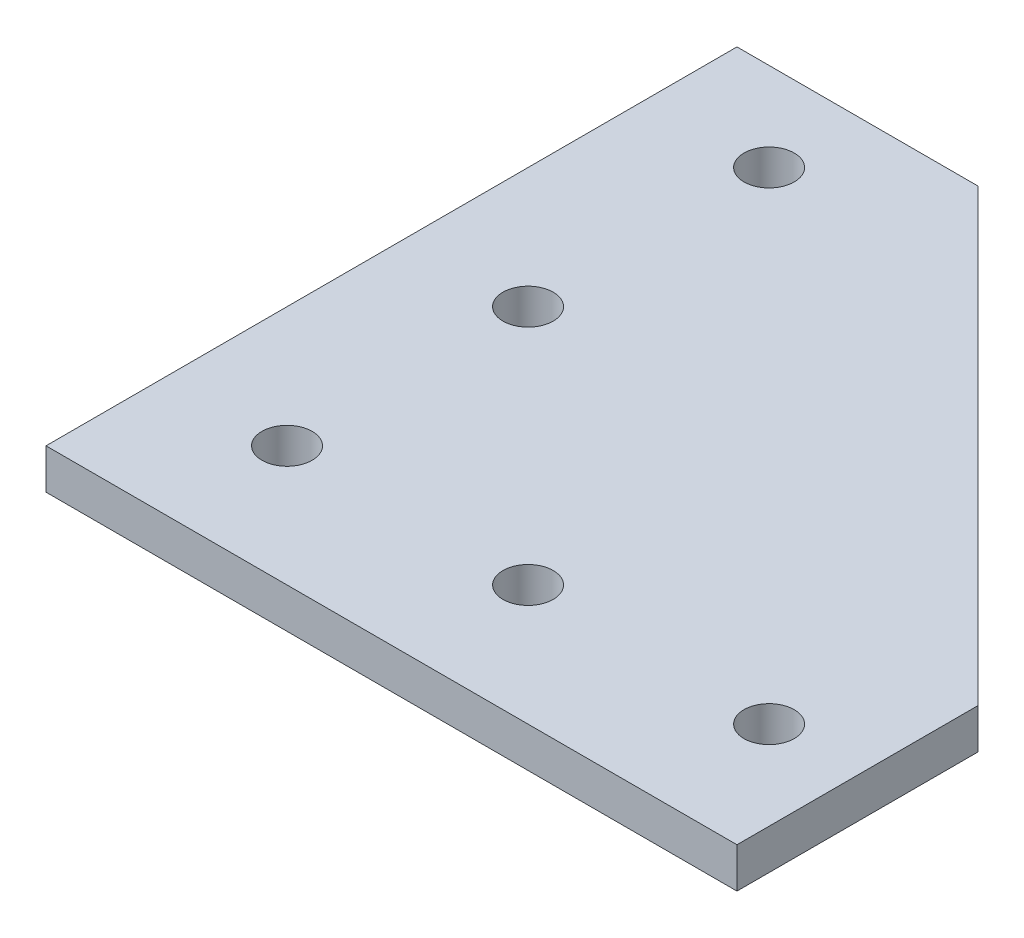
ISO-10303-21;
HEADER;
FILE_DESCRIPTION(('STEP AP214'),'2;1');
FILE_NAME('part.step','',(''),(''),'','','');
FILE_SCHEMA(('AUTOMOTIVE_DESIGN { 1 0 10303 214 1 1 1 1 }'));
ENDSEC;
DATA;
#1=APPLICATION_CONTEXT('core data for automotive mechanical design processes');
#2=APPLICATION_PROTOCOL_DEFINITION('international standard','automotive_design',2000,#1);
#3=PRODUCT_CONTEXT('',#1,'mechanical');
#4=PRODUCT('Part','Part','',(#3));
#5=PRODUCT_RELATED_PRODUCT_CATEGORY('part','',(#4));
#6=PRODUCT_DEFINITION_FORMATION('','',#4);
#7=PRODUCT_DEFINITION_CONTEXT('part definition',#1,'design');
#8=PRODUCT_DEFINITION('design','',#6,#7);
#9=PRODUCT_DEFINITION_SHAPE('','',#8);
#10=(LENGTH_UNIT() NAMED_UNIT(*) SI_UNIT(.MILLI.,.METRE.));
#11=(NAMED_UNIT(*) PLANE_ANGLE_UNIT() SI_UNIT($,.RADIAN.));
#12=(NAMED_UNIT(*) SI_UNIT($,.STERADIAN.) SOLID_ANGLE_UNIT());
#13=UNCERTAINTY_MEASURE_WITH_UNIT(LENGTH_MEASURE(1.E-05),#10,'distance_accuracy_value','');
#14=(GEOMETRIC_REPRESENTATION_CONTEXT(3) GLOBAL_UNCERTAINTY_ASSIGNED_CONTEXT((#13)) GLOBAL_UNIT_ASSIGNED_CONTEXT((#10,
#11,#12)) REPRESENTATION_CONTEXT('',''));
#15=CARTESIAN_POINT('',(0.,0.,0.));
#16=DIRECTION('',(0.,0.,1.));
#17=DIRECTION('',(1.,0.,0.));
#18=AXIS2_PLACEMENT_3D('',#15,#16,#17);
#19=CARTESIAN_POINT('',(0.,6.35,0.));
#20=DIRECTION('',(0.,1.,0.));
#21=DIRECTION('',(0.,0.,1.));
#22=AXIS2_PLACEMENT_3D('',#19,#20,#21);
#23=PLANE('',#22);
#24=CARTESIAN_POINT('',(0.,6.35,-38.1));
#25=DIRECTION('',(0.,1.,0.));
#26=DIRECTION('',(0.,0.,1.));
#27=AXIS2_PLACEMENT_3D('',#24,#25,#26);
#28=CIRCLE('',#27,3.96875);
#29=CARTESIAN_POINT('',(0.,6.35,-34.13125));
#30=VERTEX_POINT('',#29);
#31=EDGE_CURVE('E179',#30,#30,#28,.T.);
#32=ORIENTED_EDGE('',*,*,#31,.F.);
#33=EDGE_LOOP('',(#32));
#34=FACE_BOUND('',#33,.T.);
#35=CARTESIAN_POINT('',(38.1,6.35,0.));
#36=DIRECTION('',(0.,1.,0.));
#37=DIRECTION('',(0.,0.,1.));
#38=AXIS2_PLACEMENT_3D('',#35,#36,#37);
#39=CIRCLE('',#38,3.96874999999999);
#40=CARTESIAN_POINT('',(38.1,6.35,3.96874999999999));
#41=VERTEX_POINT('',#40);
#42=EDGE_CURVE('E191',#41,#41,#39,.T.);
#43=ORIENTED_EDGE('',*,*,#42,.F.);
#44=EDGE_LOOP('',(#43));
#45=FACE_BOUND('',#44,.T.);
#46=DIRECTION('',(0.,0.,1.));
#47=VECTOR('',#46,1.);
#48=CARTESIAN_POINT('',(-19.05,6.35,-90.17));
#49=LINE('',#48,#47);
#50=CARTESIAN_POINT('',(-19.05,6.35,-90.17));
#51=VERTEX_POINT('',#50);
#52=CARTESIAN_POINT('',(-19.05,6.35,19.05));
#53=VERTEX_POINT('',#52);
#54=EDGE_CURVE('E119',#51,#53,#49,.T.);
#55=ORIENTED_EDGE('',*,*,#54,.T.);
#56=DIRECTION('',(1.,0.,0.));
#57=VECTOR('',#56,1.);
#58=CARTESIAN_POINT('',(-19.05,6.35,19.05));
#59=LINE('',#58,#57);
#60=CARTESIAN_POINT('',(90.17,6.35,19.05));
#61=VERTEX_POINT('',#60);
#62=EDGE_CURVE('E86',#53,#61,#59,.T.);
#63=ORIENTED_EDGE('',*,*,#62,.T.);
#64=DIRECTION('',(0.,0.,-1.));
#65=VECTOR('',#64,1.);
#66=CARTESIAN_POINT('',(90.17,6.35,19.05));
#67=LINE('',#66,#65);
#68=CARTESIAN_POINT('',(90.17,6.35,-19.05));
#69=VERTEX_POINT('',#68);
#70=EDGE_CURVE('E90',#61,#69,#67,.T.);
#71=ORIENTED_EDGE('',*,*,#70,.T.);
#72=DIRECTION('',(-0.707106781186548,0.,-0.707106781186548));
#73=VECTOR('',#72,1.);
#74=CARTESIAN_POINT('',(19.05,6.35,-90.17));
#75=LINE('',#74,#73);
#76=CARTESIAN_POINT('',(19.05,6.35,-90.17));
#77=VERTEX_POINT('',#76);
#78=EDGE_CURVE('E94',#69,#77,#75,.T.);
#79=ORIENTED_EDGE('',*,*,#78,.T.);
#80=DIRECTION('',(-1.,0.,0.));
#81=VECTOR('',#80,1.);
#82=CARTESIAN_POINT('',(-19.05,6.35,-90.17));
#83=LINE('',#82,#81);
#84=EDGE_CURVE('E52',#77,#51,#83,.T.);
#85=ORIENTED_EDGE('',*,*,#84,.T.);
#86=EDGE_LOOP('',(#55,#63,#71,#79,#85));
#87=FACE_BOUND('',#86,.T.);
#88=CARTESIAN_POINT('',(0.,6.35,0.));
#89=DIRECTION('',(0.,1.,0.));
#90=DIRECTION('',(0.,0.,1.));
#91=AXIS2_PLACEMENT_3D('',#88,#89,#90);
#92=CIRCLE('',#91,3.96875);
#93=CARTESIAN_POINT('',(0.,6.35,3.96875));
#94=VERTEX_POINT('',#93);
#95=EDGE_CURVE('E114',#94,#94,#92,.T.);
#96=ORIENTED_EDGE('',*,*,#95,.F.);
#97=EDGE_LOOP('',(#96));
#98=FACE_BOUND('',#97,.T.);
#99=CARTESIAN_POINT('',(76.2,6.35,0.));
#100=DIRECTION('',(0.,1.,0.));
#101=DIRECTION('',(0.,0.,1.));
#102=AXIS2_PLACEMENT_3D('',#99,#100,#101);
#103=CIRCLE('',#102,3.96874999999999);
#104=CARTESIAN_POINT('',(76.2,6.35,3.96874999999999));
#105=VERTEX_POINT('',#104);
#106=EDGE_CURVE('E185',#105,#105,#103,.T.);
#107=ORIENTED_EDGE('',*,*,#106,.F.);
#108=EDGE_LOOP('',(#107));
#109=FACE_BOUND('',#108,.T.);
#110=CARTESIAN_POINT('',(0.,6.35,-76.2));
#111=DIRECTION('',(0.,1.,0.));
#112=DIRECTION('',(0.,0.,1.));
#113=AXIS2_PLACEMENT_3D('',#110,#111,#112);
#114=CIRCLE('',#113,3.96875);
#115=CARTESIAN_POINT('',(0.,6.35,-72.23125));
#116=VERTEX_POINT('',#115);
#117=EDGE_CURVE('E170',#116,#116,#114,.T.);
#118=ORIENTED_EDGE('',*,*,#117,.F.);
#119=EDGE_LOOP('',(#118));
#120=FACE_BOUND('',#119,.T.);
#121=ADVANCED_FACE('F35',(#34,#45,#87,#98,#109,#120),#23,.T.);
#122=CARTESIAN_POINT('',(0.,0.,0.));
#123=DIRECTION('',(0.,1.,0.));
#124=DIRECTION('',(0.,0.,1.));
#125=AXIS2_PLACEMENT_3D('',#122,#123,#124);
#126=PLANE('',#125);
#127=CARTESIAN_POINT('',(0.,0.,-38.1));
#128=DIRECTION('',(0.,1.,0.));
#129=DIRECTION('',(0.,0.,1.));
#130=AXIS2_PLACEMENT_3D('',#127,#128,#129);
#131=CIRCLE('',#130,3.96875);
#132=CARTESIAN_POINT('',(0.,0.,-34.13125));
#133=VERTEX_POINT('',#132);
#134=EDGE_CURVE('E176',#133,#133,#131,.T.);
#135=ORIENTED_EDGE('',*,*,#134,.T.);
#136=EDGE_LOOP('',(#135));
#137=FACE_BOUND('',#136,.T.);
#138=CARTESIAN_POINT('',(38.1,0.,0.));
#139=DIRECTION('',(0.,1.,0.));
#140=DIRECTION('',(0.,0.,1.));
#141=AXIS2_PLACEMENT_3D('',#138,#139,#140);
#142=CIRCLE('',#141,3.96874999999999);
#143=CARTESIAN_POINT('',(38.1,0.,3.96874999999999));
#144=VERTEX_POINT('',#143);
#145=EDGE_CURVE('E188',#144,#144,#142,.T.);
#146=ORIENTED_EDGE('',*,*,#145,.T.);
#147=EDGE_LOOP('',(#146));
#148=FACE_BOUND('',#147,.T.);
#149=DIRECTION('',(0.,0.,1.));
#150=VECTOR('',#149,1.);
#151=CARTESIAN_POINT('',(-19.05,0.,-90.17));
#152=LINE('',#151,#150);
#153=CARTESIAN_POINT('',(-19.05,0.,-90.17));
#154=VERTEX_POINT('',#153);
#155=CARTESIAN_POINT('',(-19.05,0.,19.05));
#156=VERTEX_POINT('',#155);
#157=EDGE_CURVE('E110',#154,#156,#152,.T.);
#158=ORIENTED_EDGE('',*,*,#157,.F.);
#159=DIRECTION('',(-1.,0.,0.));
#160=VECTOR('',#159,1.);
#161=CARTESIAN_POINT('',(-19.05,0.,-90.17));
#162=LINE('',#161,#160);
#163=CARTESIAN_POINT('',(19.05,0.,-90.17));
#164=VERTEX_POINT('',#163);
#165=EDGE_CURVE('E78',#164,#154,#162,.T.);
#166=ORIENTED_EDGE('',*,*,#165,.F.);
#167=DIRECTION('',(-0.707106781186548,0.,-0.707106781186548));
#168=VECTOR('',#167,1.);
#169=CARTESIAN_POINT('',(19.05,0.,-90.17));
#170=LINE('',#169,#168);
#171=CARTESIAN_POINT('',(90.17,0.,-19.05));
#172=VERTEX_POINT('',#171);
#173=EDGE_CURVE('E72',#172,#164,#170,.T.);
#174=ORIENTED_EDGE('',*,*,#173,.F.);
#175=DIRECTION('',(0.,0.,-1.));
#176=VECTOR('',#175,1.);
#177=CARTESIAN_POINT('',(90.17,0.,19.05));
#178=LINE('',#177,#176);
#179=CARTESIAN_POINT('',(90.17,0.,19.05));
#180=VERTEX_POINT('',#179);
#181=EDGE_CURVE('E101',#180,#172,#178,.T.);
#182=ORIENTED_EDGE('',*,*,#181,.F.);
#183=DIRECTION('',(1.,0.,0.));
#184=VECTOR('',#183,1.);
#185=CARTESIAN_POINT('',(-19.05,0.,19.05));
#186=LINE('',#185,#184);
#187=EDGE_CURVE('E113',#156,#180,#186,.T.);
#188=ORIENTED_EDGE('',*,*,#187,.F.);
#189=EDGE_LOOP('',(#158,#166,#174,#182,#188));
#190=FACE_BOUND('',#189,.T.);
#191=CARTESIAN_POINT('',(0.,0.,0.));
#192=DIRECTION('',(0.,1.,0.));
#193=DIRECTION('',(0.,0.,1.));
#194=AXIS2_PLACEMENT_3D('',#191,#192,#193);
#195=CIRCLE('',#194,3.96875);
#196=CARTESIAN_POINT('',(0.,0.,3.96875));
#197=VERTEX_POINT('',#196);
#198=EDGE_CURVE('E194',#197,#197,#195,.T.);
#199=ORIENTED_EDGE('',*,*,#198,.T.);
#200=EDGE_LOOP('',(#199));
#201=FACE_BOUND('',#200,.T.);
#202=CARTESIAN_POINT('',(76.2,0.,0.));
#203=DIRECTION('',(0.,1.,0.));
#204=DIRECTION('',(0.,0.,1.));
#205=AXIS2_PLACEMENT_3D('',#202,#203,#204);
#206=CIRCLE('',#205,3.96874999999999);
#207=CARTESIAN_POINT('',(76.2,0.,3.96874999999999));
#208=VERTEX_POINT('',#207);
#209=EDGE_CURVE('E182',#208,#208,#206,.T.);
#210=ORIENTED_EDGE('',*,*,#209,.T.);
#211=EDGE_LOOP('',(#210));
#212=FACE_BOUND('',#211,.T.);
#213=CARTESIAN_POINT('',(0.,0.,-76.2));
#214=DIRECTION('',(0.,1.,0.));
#215=DIRECTION('',(0.,0.,1.));
#216=AXIS2_PLACEMENT_3D('',#213,#214,#215);
#217=CIRCLE('',#216,3.96875);
#218=CARTESIAN_POINT('',(0.,0.,-72.23125));
#219=VERTEX_POINT('',#218);
#220=EDGE_CURVE('E173',#219,#219,#217,.T.);
#221=ORIENTED_EDGE('',*,*,#220,.T.);
#222=EDGE_LOOP('',(#221));
#223=FACE_BOUND('',#222,.T.);
#224=ADVANCED_FACE('F123',(#137,#148,#190,#201,#212,#223),#126,.F.);
#225=CARTESIAN_POINT('',(-19.05,6.35,-90.17));
#226=DIRECTION('',(1.,0.,0.));
#227=DIRECTION('',(0.,0.,-1.));
#228=AXIS2_PLACEMENT_3D('',#225,#226,#227);
#229=PLANE('',#228);
#230=ORIENTED_EDGE('',*,*,#157,.T.);
#231=DIRECTION('',(0.,-1.,0.));
#232=VECTOR('',#231,1.);
#233=CARTESIAN_POINT('',(-19.05,6.35,19.05));
#234=LINE('',#233,#232);
#235=EDGE_CURVE('E11',#53,#156,#234,.T.);
#236=ORIENTED_EDGE('',*,*,#235,.F.);
#237=ORIENTED_EDGE('',*,*,#54,.F.);
#238=DIRECTION('',(0.,-1.,0.));
#239=VECTOR('',#238,1.);
#240=CARTESIAN_POINT('',(-19.05,6.35,-90.17));
#241=LINE('',#240,#239);
#242=EDGE_CURVE('E106',#51,#154,#241,.T.);
#243=ORIENTED_EDGE('',*,*,#242,.T.);
#244=EDGE_LOOP('',(#230,#236,#237,#243));
#245=FACE_BOUND('',#244,.T.);
#246=ADVANCED_FACE('F37',(#245),#229,.F.);
#247=CARTESIAN_POINT('',(-19.05,6.35,19.05));
#248=DIRECTION('',(0.,0.,-1.));
#249=DIRECTION('',(-1.,0.,0.));
#250=AXIS2_PLACEMENT_3D('',#247,#248,#249);
#251=PLANE('',#250);
#252=ORIENTED_EDGE('',*,*,#187,.T.);
#253=DIRECTION('',(0.,-1.,0.));
#254=VECTOR('',#253,1.);
#255=CARTESIAN_POINT('',(90.17,6.35,19.05));
#256=LINE('',#255,#254);
#257=EDGE_CURVE('E44',#61,#180,#256,.T.);
#258=ORIENTED_EDGE('',*,*,#257,.F.);
#259=ORIENTED_EDGE('',*,*,#62,.F.);
#260=ORIENTED_EDGE('',*,*,#235,.T.);
#261=EDGE_LOOP('',(#252,#258,#259,#260));
#262=FACE_BOUND('',#261,.T.);
#263=ADVANCED_FACE('F251',(#262),#251,.F.);
#264=CARTESIAN_POINT('',(90.17,6.35,19.05));
#265=DIRECTION('',(-1.,0.,0.));
#266=DIRECTION('',(0.,0.,1.));
#267=AXIS2_PLACEMENT_3D('',#264,#265,#266);
#268=PLANE('',#267);
#269=ORIENTED_EDGE('',*,*,#181,.T.);
#270=DIRECTION('',(0.,-1.,0.));
#271=VECTOR('',#270,1.);
#272=CARTESIAN_POINT('',(90.17,6.35,-19.05));
#273=LINE('',#272,#271);
#274=EDGE_CURVE('E98',#69,#172,#273,.T.);
#275=ORIENTED_EDGE('',*,*,#274,.F.);
#276=ORIENTED_EDGE('',*,*,#70,.F.);
#277=ORIENTED_EDGE('',*,*,#257,.T.);
#278=EDGE_LOOP('',(#269,#275,#276,#277));
#279=FACE_BOUND('',#278,.T.);
#280=ADVANCED_FACE('F99',(#279),#268,.F.);
#281=CARTESIAN_POINT('',(19.05,6.35,-90.17));
#282=DIRECTION('',(-0.707106781186548,0.,0.707106781186548));
#283=DIRECTION('',(0.707106781186548,0.,0.707106781186548));
#284=AXIS2_PLACEMENT_3D('',#281,#282,#283);
#285=PLANE('',#284);
#286=ORIENTED_EDGE('',*,*,#173,.T.);
#287=DIRECTION('',(0.,-1.,0.));
#288=VECTOR('',#287,1.);
#289=CARTESIAN_POINT('',(19.05,6.35,-90.17));
#290=LINE('',#289,#288);
#291=EDGE_CURVE('E102',#77,#164,#290,.T.);
#292=ORIENTED_EDGE('',*,*,#291,.F.);
#293=ORIENTED_EDGE('',*,*,#78,.F.);
#294=ORIENTED_EDGE('',*,*,#274,.T.);
#295=EDGE_LOOP('',(#286,#292,#293,#294));
#296=FACE_BOUND('',#295,.T.);
#297=ADVANCED_FACE('F104',(#296),#285,.F.);
#298=CARTESIAN_POINT('',(-19.05,6.35,-90.17));
#299=DIRECTION('',(0.,0.,1.));
#300=DIRECTION('',(1.,0.,0.));
#301=AXIS2_PLACEMENT_3D('',#298,#299,#300);
#302=PLANE('',#301);
#303=ORIENTED_EDGE('',*,*,#165,.T.);
#304=ORIENTED_EDGE('',*,*,#242,.F.);
#305=ORIENTED_EDGE('',*,*,#84,.F.);
#306=ORIENTED_EDGE('',*,*,#291,.T.);
#307=EDGE_LOOP('',(#303,#304,#305,#306));
#308=FACE_BOUND('',#307,.T.);
#309=ADVANCED_FACE('F128',(#308),#302,.F.);
#310=CARTESIAN_POINT('',(0.,6.35,0.));
#311=DIRECTION('',(0.,-1.,0.));
#312=DIRECTION('',(0.,0.,-1.));
#313=AXIS2_PLACEMENT_3D('',#310,#311,#312);
#314=CYLINDRICAL_SURFACE('',#313,3.96875);
#315=ORIENTED_EDGE('',*,*,#95,.T.);
#316=EDGE_LOOP('',(#315));
#317=FACE_BOUND('',#316,.T.);
#318=ORIENTED_EDGE('',*,*,#198,.F.);
#319=EDGE_LOOP('',(#318));
#320=FACE_BOUND('',#319,.T.);
#321=ADVANCED_FACE('F130',(#317,#320),#314,.F.);
#322=CARTESIAN_POINT('',(38.1,6.35,0.));
#323=DIRECTION('',(0.,-1.,0.));
#324=DIRECTION('',(0.,0.,-1.));
#325=AXIS2_PLACEMENT_3D('',#322,#323,#324);
#326=CYLINDRICAL_SURFACE('',#325,3.96874999999999);
#327=ORIENTED_EDGE('',*,*,#42,.T.);
#328=EDGE_LOOP('',(#327));
#329=FACE_BOUND('',#328,.T.);
#330=ORIENTED_EDGE('',*,*,#145,.F.);
#331=EDGE_LOOP('',(#330));
#332=FACE_BOUND('',#331,.T.);
#333=ADVANCED_FACE('F136',(#329,#332),#326,.F.);
#334=CARTESIAN_POINT('',(76.2,6.35,0.));
#335=DIRECTION('',(0.,-1.,0.));
#336=DIRECTION('',(0.,0.,-1.));
#337=AXIS2_PLACEMENT_3D('',#334,#335,#336);
#338=CYLINDRICAL_SURFACE('',#337,3.96874999999999);
#339=ORIENTED_EDGE('',*,*,#106,.T.);
#340=EDGE_LOOP('',(#339));
#341=FACE_BOUND('',#340,.T.);
#342=ORIENTED_EDGE('',*,*,#209,.F.);
#343=EDGE_LOOP('',(#342));
#344=FACE_BOUND('',#343,.T.);
#345=ADVANCED_FACE('F153',(#341,#344),#338,.F.);
#346=CARTESIAN_POINT('',(0.,6.35,-38.1));
#347=DIRECTION('',(0.,-1.,0.));
#348=DIRECTION('',(0.,0.,-1.));
#349=AXIS2_PLACEMENT_3D('',#346,#347,#348);
#350=CYLINDRICAL_SURFACE('',#349,3.96875);
#351=ORIENTED_EDGE('',*,*,#31,.T.);
#352=EDGE_LOOP('',(#351));
#353=FACE_BOUND('',#352,.T.);
#354=ORIENTED_EDGE('',*,*,#134,.F.);
#355=EDGE_LOOP('',(#354));
#356=FACE_BOUND('',#355,.T.);
#357=ADVANCED_FACE('F157',(#353,#356),#350,.F.);
#358=CARTESIAN_POINT('',(0.,6.35,-76.2));
#359=DIRECTION('',(0.,-1.,0.));
#360=DIRECTION('',(0.,0.,-1.));
#361=AXIS2_PLACEMENT_3D('',#358,#359,#360);
#362=CYLINDRICAL_SURFACE('',#361,3.96875);
#363=ORIENTED_EDGE('',*,*,#117,.T.);
#364=EDGE_LOOP('',(#363));
#365=FACE_BOUND('',#364,.T.);
#366=ORIENTED_EDGE('',*,*,#220,.F.);
#367=EDGE_LOOP('',(#366));
#368=FACE_BOUND('',#367,.T.);
#369=ADVANCED_FACE('F161',(#365,#368),#362,.F.);
#370=CLOSED_SHELL('',(#121,#224,#246,#263,#280,#297,#309,#321,#333,#345,#357,#369));
#371=MANIFOLD_SOLID_BREP('B2',#370);
#372=ADVANCED_BREP_SHAPE_REPRESENTATION('',(#18,#371),#14);
#373=SHAPE_DEFINITION_REPRESENTATION(#9,#372);
ENDSEC;
END-ISO-10303-21;
